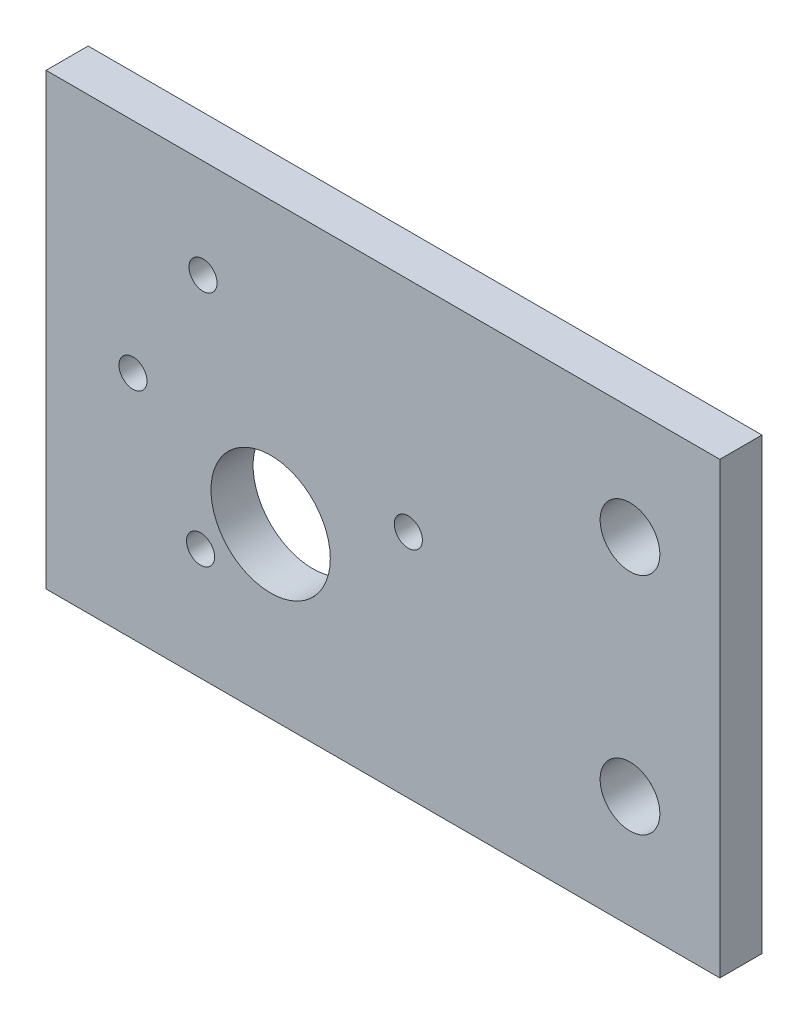
ISO-10303-21;
HEADER;
FILE_DESCRIPTION(('STEP AP214'),'2;1');
FILE_NAME('part.step','',(''),(''),'','','');
FILE_SCHEMA(('AUTOMOTIVE_DESIGN { 1 0 10303 214 1 1 1 1 }'));
ENDSEC;
DATA;
#1=APPLICATION_CONTEXT('core data for automotive mechanical design processes');
#2=APPLICATION_PROTOCOL_DEFINITION('international standard','automotive_design',2000,#1);
#3=PRODUCT_CONTEXT('',#1,'mechanical');
#4=PRODUCT('Part','Part','',(#3));
#5=PRODUCT_RELATED_PRODUCT_CATEGORY('part','',(#4));
#6=PRODUCT_DEFINITION_FORMATION('','',#4);
#7=PRODUCT_DEFINITION_CONTEXT('part definition',#1,'design');
#8=PRODUCT_DEFINITION('design','',#6,#7);
#9=PRODUCT_DEFINITION_SHAPE('','',#8);
#10=(LENGTH_UNIT() NAMED_UNIT(*) SI_UNIT(.MILLI.,.METRE.));
#11=(NAMED_UNIT(*) PLANE_ANGLE_UNIT() SI_UNIT($,.RADIAN.));
#12=(NAMED_UNIT(*) SI_UNIT($,.STERADIAN.) SOLID_ANGLE_UNIT());
#13=UNCERTAINTY_MEASURE_WITH_UNIT(LENGTH_MEASURE(1.E-05),#10,'distance_accuracy_value','');
#14=(GEOMETRIC_REPRESENTATION_CONTEXT(3) GLOBAL_UNCERTAINTY_ASSIGNED_CONTEXT((#13)) GLOBAL_UNIT_ASSIGNED_CONTEXT((#10,
#11,#12)) REPRESENTATION_CONTEXT('',''));
#15=CARTESIAN_POINT('',(0.,0.,0.));
#16=DIRECTION('',(0.,0.,1.));
#17=DIRECTION('',(1.,0.,0.));
#18=AXIS2_PLACEMENT_3D('',#15,#16,#17);
#19=CARTESIAN_POINT('',(38.1,25.4,4.7625));
#20=DIRECTION('',(-1.,0.,0.));
#21=DIRECTION('',(0.,0.,1.));
#22=AXIS2_PLACEMENT_3D('',#19,#20,#21);
#23=PLANE('',#22);
#24=DIRECTION('',(0.,1.,0.));
#25=VECTOR('',#24,1.);
#26=CARTESIAN_POINT('',(38.1,25.4,0.));
#27=LINE('',#26,#25);
#28=CARTESIAN_POINT('',(38.1,-25.4,0.));
#29=VERTEX_POINT('',#28);
#30=CARTESIAN_POINT('',(38.1,25.4,0.));
#31=VERTEX_POINT('',#30);
#32=EDGE_CURVE('E100',#29,#31,#27,.T.);
#33=ORIENTED_EDGE('',*,*,#32,.T.);
#34=DIRECTION('',(0.,0.,-1.));
#35=VECTOR('',#34,1.);
#36=CARTESIAN_POINT('',(38.1,25.4,4.7625));
#37=LINE('',#36,#35);
#38=CARTESIAN_POINT('',(38.1,25.4,4.7625));
#39=VERTEX_POINT('',#38);
#40=EDGE_CURVE('E11',#39,#31,#37,.T.);
#41=ORIENTED_EDGE('',*,*,#40,.F.);
#42=DIRECTION('',(0.,1.,0.));
#43=VECTOR('',#42,1.);
#44=CARTESIAN_POINT('',(38.1,25.4,4.7625));
#45=LINE('',#44,#43);
#46=CARTESIAN_POINT('',(38.1,-25.4,4.7625));
#47=VERTEX_POINT('',#46);
#48=EDGE_CURVE('E88',#47,#39,#45,.T.);
#49=ORIENTED_EDGE('',*,*,#48,.F.);
#50=DIRECTION('',(0.,0.,-1.));
#51=VECTOR('',#50,1.);
#52=CARTESIAN_POINT('',(38.1,-25.4,4.7625));
#53=LINE('',#52,#51);
#54=EDGE_CURVE('E96',#47,#29,#53,.T.);
#55=ORIENTED_EDGE('',*,*,#54,.T.);
#56=EDGE_LOOP('',(#33,#41,#49,#55));
#57=FACE_BOUND('',#56,.T.);
#58=ADVANCED_FACE('F37',(#57),#23,.F.);
#59=CARTESIAN_POINT('',(-38.1,25.4,4.7625));
#60=DIRECTION('',(0.,-1.,0.));
#61=DIRECTION('',(0.,0.,-1.));
#62=AXIS2_PLACEMENT_3D('',#59,#60,#61);
#63=PLANE('',#62);
#64=DIRECTION('',(-1.,0.,0.));
#65=VECTOR('',#64,1.);
#66=CARTESIAN_POINT('',(-38.1,25.4,0.));
#67=LINE('',#66,#65);
#68=CARTESIAN_POINT('',(-38.1,25.4,0.));
#69=VERTEX_POINT('',#68);
#70=EDGE_CURVE('E92',#31,#69,#67,.T.);
#71=ORIENTED_EDGE('',*,*,#70,.T.);
#72=DIRECTION('',(0.,0.,-1.));
#73=VECTOR('',#72,1.);
#74=CARTESIAN_POINT('',(-38.1,25.4,4.7625));
#75=LINE('',#74,#73);
#76=CARTESIAN_POINT('',(-38.1,25.4,4.7625));
#77=VERTEX_POINT('',#76);
#78=EDGE_CURVE('E45',#77,#69,#75,.T.);
#79=ORIENTED_EDGE('',*,*,#78,.F.);
#80=DIRECTION('',(-1.,0.,0.));
#81=VECTOR('',#80,1.);
#82=CARTESIAN_POINT('',(-38.1,25.4,4.7625));
#83=LINE('',#82,#81);
#84=EDGE_CURVE('E83',#39,#77,#83,.T.);
#85=ORIENTED_EDGE('',*,*,#84,.F.);
#86=ORIENTED_EDGE('',*,*,#40,.T.);
#87=EDGE_LOOP('',(#71,#79,#85,#86));
#88=FACE_BOUND('',#87,.T.);
#89=ADVANCED_FACE('F91',(#88),#63,.F.);
#90=CARTESIAN_POINT('',(-38.1,25.4,4.7625));
#91=DIRECTION('',(1.,0.,0.));
#92=DIRECTION('',(0.,1.,0.));
#93=AXIS2_PLACEMENT_3D('',#90,#91,#92);
#94=PLANE('',#93);
#95=DIRECTION('',(0.,-1.,0.));
#96=VECTOR('',#95,1.);
#97=CARTESIAN_POINT('',(-38.1,25.4,0.));
#98=LINE('',#97,#96);
#99=CARTESIAN_POINT('',(-38.1,-25.4,0.));
#100=VERTEX_POINT('',#99);
#101=EDGE_CURVE('E70',#69,#100,#98,.T.);
#102=ORIENTED_EDGE('',*,*,#101,.T.);
#103=DIRECTION('',(0.,0.,-1.));
#104=VECTOR('',#103,1.);
#105=CARTESIAN_POINT('',(-38.1,-25.4,4.7625));
#106=LINE('',#105,#104);
#107=CARTESIAN_POINT('',(-38.1,-25.4,4.7625));
#108=VERTEX_POINT('',#107);
#109=EDGE_CURVE('E93',#108,#100,#106,.T.);
#110=ORIENTED_EDGE('',*,*,#109,.F.);
#111=DIRECTION('',(0.,-1.,0.));
#112=VECTOR('',#111,1.);
#113=CARTESIAN_POINT('',(-38.1,25.4,4.7625));
#114=LINE('',#113,#112);
#115=EDGE_CURVE('E86',#77,#108,#114,.T.);
#116=ORIENTED_EDGE('',*,*,#115,.F.);
#117=ORIENTED_EDGE('',*,*,#78,.T.);
#118=EDGE_LOOP('',(#102,#110,#116,#117));
#119=FACE_BOUND('',#118,.T.);
#120=ADVANCED_FACE('F94',(#119),#94,.F.);
#121=CARTESIAN_POINT('',(-38.1,-25.4,4.7625));
#122=DIRECTION('',(0.,1.,0.));
#123=DIRECTION('',(0.,0.,1.));
#124=AXIS2_PLACEMENT_3D('',#121,#122,#123);
#125=PLANE('',#124);
#126=DIRECTION('',(1.,0.,0.));
#127=VECTOR('',#126,1.);
#128=CARTESIAN_POINT('',(-38.1,-25.4,0.));
#129=LINE('',#128,#127);
#130=EDGE_CURVE('E76',#100,#29,#129,.T.);
#131=ORIENTED_EDGE('',*,*,#130,.T.);
#132=ORIENTED_EDGE('',*,*,#54,.F.);
#133=DIRECTION('',(1.,0.,0.));
#134=VECTOR('',#133,1.);
#135=CARTESIAN_POINT('',(-38.1,-25.4,4.7625));
#136=LINE('',#135,#134);
#137=EDGE_CURVE('E53',#108,#47,#136,.T.);
#138=ORIENTED_EDGE('',*,*,#137,.F.);
#139=ORIENTED_EDGE('',*,*,#109,.T.);
#140=EDGE_LOOP('',(#131,#132,#138,#139));
#141=FACE_BOUND('',#140,.T.);
#142=ADVANCED_FACE('F108',(#141),#125,.F.);
#143=CARTESIAN_POINT('',(0.,0.,4.7625));
#144=DIRECTION('',(0.,0.,1.));
#145=DIRECTION('',(1.,0.,0.));
#146=AXIS2_PLACEMENT_3D('',#143,#144,#145);
#147=PLANE('',#146);
#148=CARTESIAN_POINT('',(27.94,12.7,4.7625));
#149=DIRECTION('',(0.,0.,1.));
#150=DIRECTION('',(1.,0.,0.));
#151=AXIS2_PLACEMENT_3D('',#148,#149,#150);
#152=CIRCLE('',#151,3.3782);
#153=CARTESIAN_POINT('',(31.3182,12.7,4.7625));
#154=VERTEX_POINT('',#153);
#155=EDGE_CURVE('E152',#154,#154,#152,.T.);
#156=ORIENTED_EDGE('',*,*,#155,.F.);
#157=EDGE_LOOP('',(#156));
#158=FACE_BOUND('',#157,.T.);
#159=CARTESIAN_POINT('',(27.94,-12.7,4.7625));
#160=DIRECTION('',(0.,0.,1.));
#161=DIRECTION('',(1.,0.,0.));
#162=AXIS2_PLACEMENT_3D('',#159,#160,#161);
#163=CIRCLE('',#162,3.3782);
#164=CARTESIAN_POINT('',(31.3182,-12.7,4.7625));
#165=VERTEX_POINT('',#164);
#166=EDGE_CURVE('E146',#165,#165,#163,.T.);
#167=ORIENTED_EDGE('',*,*,#166,.F.);
#168=EDGE_LOOP('',(#167));
#169=FACE_BOUND('',#168,.T.);
#170=CARTESIAN_POINT('',(-20.3454,14.224285390256,4.7625));
#171=DIRECTION('',(0.,0.,1.));
#172=DIRECTION('',(1.,0.,0.));
#173=AXIS2_PLACEMENT_3D('',#170,#171,#172);
#174=CIRCLE('',#173,1.5875);
#175=CARTESIAN_POINT('',(-18.7579,14.224285390256,4.7625));
#176=VERTEX_POINT('',#175);
#177=EDGE_CURVE('E140',#176,#176,#174,.T.);
#178=ORIENTED_EDGE('',*,*,#177,.F.);
#179=EDGE_LOOP('',(#178));
#180=FACE_BOUND('',#179,.T.);
#181=CARTESIAN_POINT('',(-28.2702,0.660400000000002,4.7625));
#182=DIRECTION('',(0.,0.,1.));
#183=DIRECTION('',(1.,0.,0.));
#184=AXIS2_PLACEMENT_3D('',#181,#182,#183);
#185=CIRCLE('',#184,1.5875);
#186=CARTESIAN_POINT('',(-26.6827,0.660400000000002,4.7625));
#187=VERTEX_POINT('',#186);
#188=EDGE_CURVE('E134',#187,#187,#185,.T.);
#189=ORIENTED_EDGE('',*,*,#188,.F.);
#190=EDGE_LOOP('',(#189));
#191=FACE_BOUND('',#190,.T.);
#192=CARTESIAN_POINT('',(-20.6248,-12.7421621804191,4.7625));
#193=DIRECTION('',(0.,0.,1.));
#194=DIRECTION('',(1.,0.,0.));
#195=AXIS2_PLACEMENT_3D('',#192,#193,#194);
#196=CIRCLE('',#195,1.5875);
#197=CARTESIAN_POINT('',(-19.0373,-12.7421621804191,4.7625));
#198=VERTEX_POINT('',#197);
#199=EDGE_CURVE('E128',#198,#198,#196,.T.);
#200=ORIENTED_EDGE('',*,*,#199,.F.);
#201=EDGE_LOOP('',(#200));
#202=FACE_BOUND('',#201,.T.);
#203=CARTESIAN_POINT('',(2.8702,0.660400000000002,4.7625));
#204=DIRECTION('',(0.,0.,1.));
#205=DIRECTION('',(1.,0.,0.));
#206=AXIS2_PLACEMENT_3D('',#203,#204,#205);
#207=CIRCLE('',#206,1.5875);
#208=CARTESIAN_POINT('',(4.4577,0.660400000000002,4.7625));
#209=VERTEX_POINT('',#208);
#210=EDGE_CURVE('E122',#209,#209,#207,.T.);
#211=ORIENTED_EDGE('',*,*,#210,.F.);
#212=EDGE_LOOP('',(#211));
#213=FACE_BOUND('',#212,.T.);
#214=CARTESIAN_POINT('',(-12.7,-6.35,4.7625));
#215=DIRECTION('',(0.,0.,1.));
#216=DIRECTION('',(1.,0.,0.));
#217=AXIS2_PLACEMENT_3D('',#214,#215,#216);
#218=CIRCLE('',#217,6.746875);
#219=CARTESIAN_POINT('',(-5.953125,-6.35,4.7625));
#220=VERTEX_POINT('',#219);
#221=EDGE_CURVE('E116',#220,#220,#218,.T.);
#222=ORIENTED_EDGE('',*,*,#221,.F.);
#223=EDGE_LOOP('',(#222));
#224=FACE_BOUND('',#223,.T.);
#225=ORIENTED_EDGE('',*,*,#48,.T.);
#226=ORIENTED_EDGE('',*,*,#84,.T.);
#227=ORIENTED_EDGE('',*,*,#115,.T.);
#228=ORIENTED_EDGE('',*,*,#137,.T.);
#229=EDGE_LOOP('',(#225,#226,#227,#228));
#230=FACE_BOUND('',#229,.T.);
#231=ADVANCED_FACE('F84',(#158,#169,#180,#191,#202,#213,#224,#230),#147,.T.);
#232=CARTESIAN_POINT('',(0.,0.,0.));
#233=DIRECTION('',(0.,0.,1.));
#234=DIRECTION('',(1.,0.,0.));
#235=AXIS2_PLACEMENT_3D('',#232,#233,#234);
#236=PLANE('',#235);
#237=CARTESIAN_POINT('',(27.94,12.7,0.));
#238=DIRECTION('',(0.,0.,1.));
#239=DIRECTION('',(1.,0.,0.));
#240=AXIS2_PLACEMENT_3D('',#237,#238,#239);
#241=CIRCLE('',#240,3.3782);
#242=CARTESIAN_POINT('',(31.3182,12.7,0.));
#243=VERTEX_POINT('',#242);
#244=EDGE_CURVE('E149',#243,#243,#241,.T.);
#245=ORIENTED_EDGE('',*,*,#244,.T.);
#246=EDGE_LOOP('',(#245));
#247=FACE_BOUND('',#246,.T.);
#248=CARTESIAN_POINT('',(27.94,-12.7,0.));
#249=DIRECTION('',(0.,0.,1.));
#250=DIRECTION('',(1.,0.,0.));
#251=AXIS2_PLACEMENT_3D('',#248,#249,#250);
#252=CIRCLE('',#251,3.3782);
#253=CARTESIAN_POINT('',(31.3182,-12.7,0.));
#254=VERTEX_POINT('',#253);
#255=EDGE_CURVE('E143',#254,#254,#252,.T.);
#256=ORIENTED_EDGE('',*,*,#255,.T.);
#257=EDGE_LOOP('',(#256));
#258=FACE_BOUND('',#257,.T.);
#259=CARTESIAN_POINT('',(-20.3454,14.224285390256,0.));
#260=DIRECTION('',(0.,0.,1.));
#261=DIRECTION('',(1.,0.,0.));
#262=AXIS2_PLACEMENT_3D('',#259,#260,#261);
#263=CIRCLE('',#262,1.5875);
#264=CARTESIAN_POINT('',(-18.7579,14.224285390256,0.));
#265=VERTEX_POINT('',#264);
#266=EDGE_CURVE('E137',#265,#265,#263,.T.);
#267=ORIENTED_EDGE('',*,*,#266,.T.);
#268=EDGE_LOOP('',(#267));
#269=FACE_BOUND('',#268,.T.);
#270=CARTESIAN_POINT('',(-28.2702,0.660400000000002,0.));
#271=DIRECTION('',(0.,0.,1.));
#272=DIRECTION('',(1.,0.,0.));
#273=AXIS2_PLACEMENT_3D('',#270,#271,#272);
#274=CIRCLE('',#273,1.5875);
#275=CARTESIAN_POINT('',(-26.6827,0.660400000000002,0.));
#276=VERTEX_POINT('',#275);
#277=EDGE_CURVE('E131',#276,#276,#274,.T.);
#278=ORIENTED_EDGE('',*,*,#277,.T.);
#279=EDGE_LOOP('',(#278));
#280=FACE_BOUND('',#279,.T.);
#281=CARTESIAN_POINT('',(-20.6248,-12.7421621804191,0.));
#282=DIRECTION('',(0.,0.,1.));
#283=DIRECTION('',(1.,0.,0.));
#284=AXIS2_PLACEMENT_3D('',#281,#282,#283);
#285=CIRCLE('',#284,1.5875);
#286=CARTESIAN_POINT('',(-19.0373,-12.7421621804191,0.));
#287=VERTEX_POINT('',#286);
#288=EDGE_CURVE('E125',#287,#287,#285,.T.);
#289=ORIENTED_EDGE('',*,*,#288,.T.);
#290=EDGE_LOOP('',(#289));
#291=FACE_BOUND('',#290,.T.);
#292=CARTESIAN_POINT('',(2.8702,0.660400000000002,0.));
#293=DIRECTION('',(0.,0.,1.));
#294=DIRECTION('',(1.,0.,0.));
#295=AXIS2_PLACEMENT_3D('',#292,#293,#294);
#296=CIRCLE('',#295,1.5875);
#297=CARTESIAN_POINT('',(4.4577,0.660400000000002,0.));
#298=VERTEX_POINT('',#297);
#299=EDGE_CURVE('E119',#298,#298,#296,.T.);
#300=ORIENTED_EDGE('',*,*,#299,.T.);
#301=EDGE_LOOP('',(#300));
#302=FACE_BOUND('',#301,.T.);
#303=CARTESIAN_POINT('',(-12.7,-6.35,0.));
#304=DIRECTION('',(0.,0.,1.));
#305=DIRECTION('',(1.,0.,0.));
#306=AXIS2_PLACEMENT_3D('',#303,#304,#305);
#307=CIRCLE('',#306,6.746875);
#308=CARTESIAN_POINT('',(-5.953125,-6.35,0.));
#309=VERTEX_POINT('',#308);
#310=EDGE_CURVE('E103',#309,#309,#307,.T.);
#311=ORIENTED_EDGE('',*,*,#310,.T.);
#312=EDGE_LOOP('',(#311));
#313=FACE_BOUND('',#312,.T.);
#314=ORIENTED_EDGE('',*,*,#32,.F.);
#315=ORIENTED_EDGE('',*,*,#130,.F.);
#316=ORIENTED_EDGE('',*,*,#101,.F.);
#317=ORIENTED_EDGE('',*,*,#70,.F.);
#318=EDGE_LOOP('',(#314,#315,#316,#317));
#319=FACE_BOUND('',#318,.T.);
#320=ADVANCED_FACE('F111',(#247,#258,#269,#280,#291,#302,#313,#319),#236,.F.);
#321=CARTESIAN_POINT('',(-12.7,-6.35,4.7625));
#322=DIRECTION('',(0.,0.,1.));
#323=DIRECTION('',(1.,0.,0.));
#324=AXIS2_PLACEMENT_3D('',#321,#322,#323);
#325=CYLINDRICAL_SURFACE('',#324,6.746875);
#326=ORIENTED_EDGE('',*,*,#310,.F.);
#327=EDGE_LOOP('',(#326));
#328=FACE_BOUND('',#327,.T.);
#329=ORIENTED_EDGE('',*,*,#221,.T.);
#330=EDGE_LOOP('',(#329));
#331=FACE_BOUND('',#330,.T.);
#332=ADVANCED_FACE('F173',(#328,#331),#325,.F.);
#333=CARTESIAN_POINT('',(2.8702,0.660400000000002,4.7625));
#334=DIRECTION('',(0.,0.,1.));
#335=DIRECTION('',(1.,0.,0.));
#336=AXIS2_PLACEMENT_3D('',#333,#334,#335);
#337=CYLINDRICAL_SURFACE('',#336,1.5875);
#338=ORIENTED_EDGE('',*,*,#299,.F.);
#339=EDGE_LOOP('',(#338));
#340=FACE_BOUND('',#339,.T.);
#341=ORIENTED_EDGE('',*,*,#210,.T.);
#342=EDGE_LOOP('',(#341));
#343=FACE_BOUND('',#342,.T.);
#344=ADVANCED_FACE('F175',(#340,#343),#337,.F.);
#345=CARTESIAN_POINT('',(-20.6248,-12.7421621804191,4.7625));
#346=DIRECTION('',(0.,0.,1.));
#347=DIRECTION('',(1.,0.,0.));
#348=AXIS2_PLACEMENT_3D('',#345,#346,#347);
#349=CYLINDRICAL_SURFACE('',#348,1.5875);
#350=ORIENTED_EDGE('',*,*,#288,.F.);
#351=EDGE_LOOP('',(#350));
#352=FACE_BOUND('',#351,.T.);
#353=ORIENTED_EDGE('',*,*,#199,.T.);
#354=EDGE_LOOP('',(#353));
#355=FACE_BOUND('',#354,.T.);
#356=ADVANCED_FACE('F182',(#352,#355),#349,.F.);
#357=CARTESIAN_POINT('',(-28.2702,0.660400000000002,4.7625));
#358=DIRECTION('',(0.,0.,1.));
#359=DIRECTION('',(1.,0.,0.));
#360=AXIS2_PLACEMENT_3D('',#357,#358,#359);
#361=CYLINDRICAL_SURFACE('',#360,1.5875);
#362=ORIENTED_EDGE('',*,*,#277,.F.);
#363=EDGE_LOOP('',(#362));
#364=FACE_BOUND('',#363,.T.);
#365=ORIENTED_EDGE('',*,*,#188,.T.);
#366=EDGE_LOOP('',(#365));
#367=FACE_BOUND('',#366,.T.);
#368=ADVANCED_FACE('F241',(#364,#367),#361,.F.);
#369=CARTESIAN_POINT('',(-20.3454,14.224285390256,4.7625));
#370=DIRECTION('',(0.,0.,1.));
#371=DIRECTION('',(1.,0.,0.));
#372=AXIS2_PLACEMENT_3D('',#369,#370,#371);
#373=CYLINDRICAL_SURFACE('',#372,1.5875);
#374=ORIENTED_EDGE('',*,*,#266,.F.);
#375=EDGE_LOOP('',(#374));
#376=FACE_BOUND('',#375,.T.);
#377=ORIENTED_EDGE('',*,*,#177,.T.);
#378=EDGE_LOOP('',(#377));
#379=FACE_BOUND('',#378,.T.);
#380=ADVANCED_FACE('F222',(#376,#379),#373,.F.);
#381=CARTESIAN_POINT('',(27.94,-12.7,4.7625));
#382=DIRECTION('',(0.,0.,1.));
#383=DIRECTION('',(1.,0.,0.));
#384=AXIS2_PLACEMENT_3D('',#381,#382,#383);
#385=CYLINDRICAL_SURFACE('',#384,3.3782);
#386=ORIENTED_EDGE('',*,*,#255,.F.);
#387=EDGE_LOOP('',(#386));
#388=FACE_BOUND('',#387,.T.);
#389=ORIENTED_EDGE('',*,*,#166,.T.);
#390=EDGE_LOOP('',(#389));
#391=FACE_BOUND('',#390,.T.);
#392=ADVANCED_FACE('F217',(#388,#391),#385,.F.);
#393=CARTESIAN_POINT('',(27.94,12.7,4.7625));
#394=DIRECTION('',(0.,0.,1.));
#395=DIRECTION('',(1.,0.,0.));
#396=AXIS2_PLACEMENT_3D('',#393,#394,#395);
#397=CYLINDRICAL_SURFACE('',#396,3.3782);
#398=ORIENTED_EDGE('',*,*,#244,.F.);
#399=EDGE_LOOP('',(#398));
#400=FACE_BOUND('',#399,.T.);
#401=ORIENTED_EDGE('',*,*,#155,.T.);
#402=EDGE_LOOP('',(#401));
#403=FACE_BOUND('',#402,.T.);
#404=ADVANCED_FACE('F156',(#400,#403),#397,.F.);
#405=CLOSED_SHELL('',(#58,#89,#120,#142,#231,#320,#332,#344,#356,#368,#380,#392,#404));
#406=MANIFOLD_SOLID_BREP('B2',#405);
#407=ADVANCED_BREP_SHAPE_REPRESENTATION('',(#18,#406),#14);
#408=SHAPE_DEFINITION_REPRESENTATION(#9,#407);
ENDSEC;
END-ISO-10303-21;
